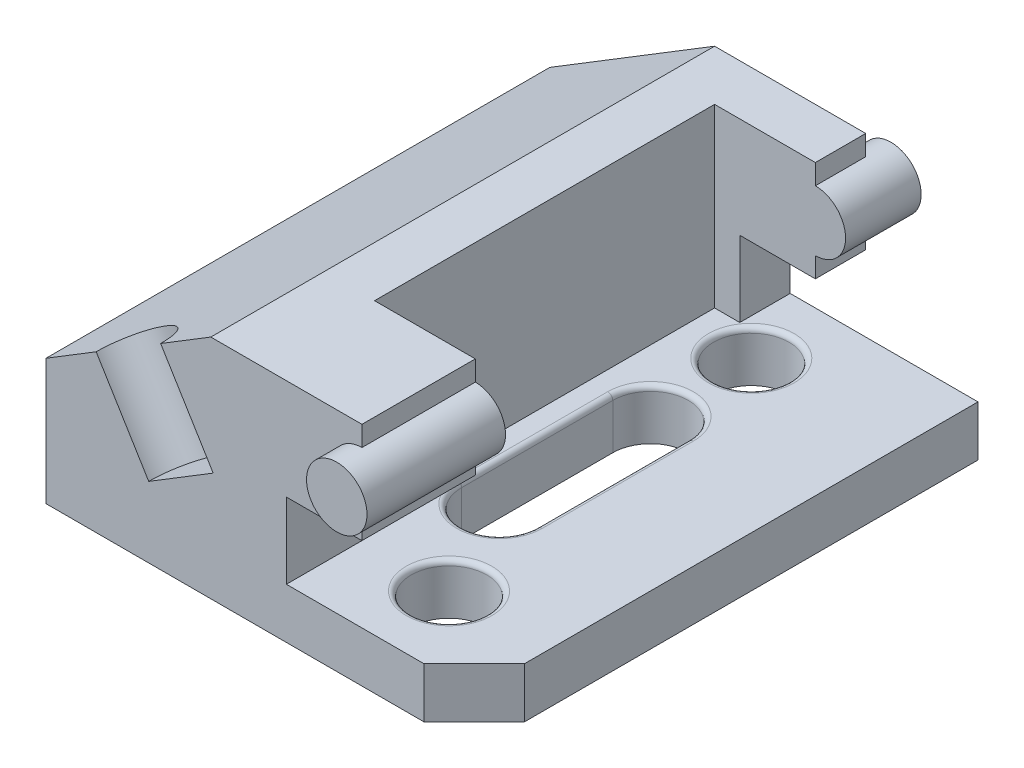
ISO-10303-21;
HEADER;
FILE_DESCRIPTION(('STEP AP214'),'2;1');
FILE_NAME('part.step','',(''),(''),'','','');
FILE_SCHEMA(('AUTOMOTIVE_DESIGN { 1 0 10303 214 1 1 1 1 }'));
ENDSEC;
DATA;
#1=APPLICATION_CONTEXT('core data for automotive mechanical design processes');
#2=APPLICATION_PROTOCOL_DEFINITION('international standard','automotive_design',2000,#1);
#3=PRODUCT_CONTEXT('',#1,'mechanical');
#4=PRODUCT('Part','Part','',(#3));
#5=PRODUCT_RELATED_PRODUCT_CATEGORY('part','',(#4));
#6=PRODUCT_DEFINITION_FORMATION('','',#4);
#7=PRODUCT_DEFINITION_CONTEXT('part definition',#1,'design');
#8=PRODUCT_DEFINITION('design','',#6,#7);
#9=PRODUCT_DEFINITION_SHAPE('','',#8);
#10=(LENGTH_UNIT() NAMED_UNIT(*) SI_UNIT(.MILLI.,.METRE.));
#11=(NAMED_UNIT(*) PLANE_ANGLE_UNIT() SI_UNIT($,.RADIAN.));
#12=(NAMED_UNIT(*) SI_UNIT($,.STERADIAN.) SOLID_ANGLE_UNIT());
#13=UNCERTAINTY_MEASURE_WITH_UNIT(LENGTH_MEASURE(1.E-05),#10,'distance_accuracy_value','');
#14=(GEOMETRIC_REPRESENTATION_CONTEXT(3) GLOBAL_UNCERTAINTY_ASSIGNED_CONTEXT((#13)) GLOBAL_UNIT_ASSIGNED_CONTEXT((#10,
#11,#12)) REPRESENTATION_CONTEXT('',''));
#15=CARTESIAN_POINT('',(0.,0.,0.));
#16=DIRECTION('',(0.,0.,1.));
#17=DIRECTION('',(1.,0.,0.));
#18=AXIS2_PLACEMENT_3D('',#15,#16,#17);
#19=CARTESIAN_POINT('',(62.7150812468734,45.,-100.));
#20=DIRECTION('',(1.,0.,0.));
#21=DIRECTION('',(0.,1.,0.));
#22=AXIS2_PLACEMENT_3D('',#19,#20,#21);
#23=PLANE('',#22);
#24=DIRECTION('',(0.,-1.,0.));
#25=VECTOR('',#24,1.);
#26=CARTESIAN_POINT('',(62.7150812468734,45.,-22.5));
#27=LINE('',#26,#25);
#28=CARTESIAN_POINT('',(62.7150812468734,29.,-22.5));
#29=VERTEX_POINT('',#28);
#30=CARTESIAN_POINT('',(62.7150812468734,25.,-22.5));
#31=VERTEX_POINT('',#30);
#32=EDGE_CURVE('E267',#29,#31,#27,.T.);
#33=ORIENTED_EDGE('',*,*,#32,.F.);
#34=DIRECTION('',(0.,0.,-1.));
#35=VECTOR('',#34,1.);
#36=CARTESIAN_POINT('',(62.7150812468734,29.,4.99999999999999));
#37=LINE('',#36,#35);
#38=CARTESIAN_POINT('',(62.7150812468734,29.,0.));
#39=VERTEX_POINT('',#38);
#40=EDGE_CURVE('E283',#29,#39,#37,.F.);
#41=ORIENTED_EDGE('',*,*,#40,.T.);
#42=DIRECTION('',(0.,1.,0.));
#43=VECTOR('',#42,1.);
#44=CARTESIAN_POINT('',(62.7150812468734,45.,0.));
#45=LINE('',#44,#43);
#46=CARTESIAN_POINT('',(62.7150812468734,25.,0.));
#47=VERTEX_POINT('',#46);
#48=EDGE_CURVE('E356',#47,#39,#45,.T.);
#49=ORIENTED_EDGE('',*,*,#48,.F.);
#50=DIRECTION('',(0.,0.,1.));
#51=VECTOR('',#50,1.);
#52=CARTESIAN_POINT('',(62.7150812468734,25.,-100.));
#53=LINE('',#52,#51);
#54=EDGE_CURVE('E377',#31,#47,#53,.T.);
#55=ORIENTED_EDGE('',*,*,#54,.F.);
#56=EDGE_LOOP('',(#33,#41,#49,#55));
#57=FACE_BOUND('',#56,.T.);
#58=ADVANCED_FACE('F37',(#57),#23,.T.);
#59=DIRECTION('',(0.,-1.,0.));
#60=VECTOR('',#59,1.);
#61=CARTESIAN_POINT('',(62.7150812468734,45.,-22.5));
#62=LINE('',#61,#60);
#63=CARTESIAN_POINT('',(62.7150812468734,45.,-22.5));
#64=VERTEX_POINT('',#63);
#65=CARTESIAN_POINT('',(62.7150812468734,41.,-22.5));
#66=VERTEX_POINT('',#65);
#67=EDGE_CURVE('E265',#64,#66,#62,.T.);
#68=ORIENTED_EDGE('',*,*,#67,.F.);
#69=DIRECTION('',(0.,0.,1.));
#70=VECTOR('',#69,1.);
#71=CARTESIAN_POINT('',(62.7150812468734,45.,-100.));
#72=LINE('',#71,#70);
#73=CARTESIAN_POINT('',(62.7150812468734,45.,0.));
#74=VERTEX_POINT('',#73);
#75=EDGE_CURVE('E373',#64,#74,#72,.T.);
#76=ORIENTED_EDGE('',*,*,#75,.T.);
#77=CARTESIAN_POINT('',(62.7150812468734,41.,0.));
#78=VERTEX_POINT('',#77);
#79=EDGE_CURVE('E355',#78,#74,#45,.T.);
#80=ORIENTED_EDGE('',*,*,#79,.F.);
#81=DIRECTION('',(0.,0.,-1.));
#82=VECTOR('',#81,1.);
#83=CARTESIAN_POINT('',(62.7150812468734,41.,4.99999999999999));
#84=LINE('',#83,#82);
#85=EDGE_CURVE('E280',#78,#66,#84,.T.);
#86=ORIENTED_EDGE('',*,*,#85,.T.);
#87=EDGE_LOOP('',(#68,#76,#80,#86));
#88=FACE_BOUND('',#87,.T.);
#89=ADVANCED_FACE('F552',(#88),#23,.T.);
#90=CARTESIAN_POINT('',(47.7150812468734,25.,-100.));
#91=DIRECTION('',(0.,-1.,0.));
#92=DIRECTION('',(0.,0.,-1.));
#93=AXIS2_PLACEMENT_3D('',#90,#91,#92);
#94=PLANE('',#93);
#95=DIRECTION('',(-1.,0.,0.));
#96=VECTOR('',#95,1.);
#97=CARTESIAN_POINT('',(47.7150812468734,25.,-22.5));
#98=LINE('',#97,#96);
#99=CARTESIAN_POINT('',(47.7150812468734,25.,-22.5));
#100=VERTEX_POINT('',#99);
#101=EDGE_CURVE('E269',#31,#100,#98,.T.);
#102=ORIENTED_EDGE('',*,*,#101,.F.);
#103=ORIENTED_EDGE('',*,*,#54,.T.);
#104=DIRECTION('',(1.,0.,0.));
#105=VECTOR('',#104,1.);
#106=CARTESIAN_POINT('',(47.7150812468734,25.,0.));
#107=LINE('',#106,#105);
#108=CARTESIAN_POINT('',(47.7150812468734,25.,0.));
#109=VERTEX_POINT('',#108);
#110=EDGE_CURVE('E352',#109,#47,#107,.T.);
#111=ORIENTED_EDGE('',*,*,#110,.F.);
#112=DIRECTION('',(0.,0.,1.));
#113=VECTOR('',#112,1.);
#114=CARTESIAN_POINT('',(47.7150812468734,25.,-100.));
#115=LINE('',#114,#113);
#116=EDGE_CURVE('E381',#100,#109,#115,.T.);
#117=ORIENTED_EDGE('',*,*,#116,.F.);
#118=EDGE_LOOP('',(#102,#103,#111,#117));
#119=FACE_BOUND('',#118,.T.);
#120=ADVANCED_FACE('F560',(#119),#94,.T.);
#121=CARTESIAN_POINT('',(47.7150812468734,9.99999999999999,-100.));
#122=DIRECTION('',(1.,0.,0.));
#123=DIRECTION('',(0.,0.,-1.));
#124=AXIS2_PLACEMENT_3D('',#121,#122,#123);
#125=PLANE('',#124);
#126=DIRECTION('',(0.,-1.,0.));
#127=VECTOR('',#126,1.);
#128=CARTESIAN_POINT('',(47.7150812468734,9.99999999999999,-22.5));
#129=LINE('',#128,#127);
#130=CARTESIAN_POINT('',(47.7150812468734,9.99999999999999,-22.5));
#131=VERTEX_POINT('',#130);
#132=EDGE_CURVE('E271',#100,#131,#129,.T.);
#133=ORIENTED_EDGE('',*,*,#132,.F.);
#134=ORIENTED_EDGE('',*,*,#116,.T.);
#135=DIRECTION('',(0.,1.,0.));
#136=VECTOR('',#135,1.);
#137=CARTESIAN_POINT('',(47.7150812468734,9.99999999999999,0.));
#138=LINE('',#137,#136);
#139=CARTESIAN_POINT('',(47.7150812468734,9.99999999999999,0.));
#140=VERTEX_POINT('',#139);
#141=EDGE_CURVE('E349',#140,#109,#138,.T.);
#142=ORIENTED_EDGE('',*,*,#141,.F.);
#143=DIRECTION('',(0.,0.,1.));
#144=VECTOR('',#143,1.);
#145=CARTESIAN_POINT('',(47.7150812468734,9.99999999999999,-100.));
#146=LINE('',#145,#144);
#147=EDGE_CURVE('E385',#131,#140,#146,.T.);
#148=ORIENTED_EDGE('',*,*,#147,.F.);
#149=EDGE_LOOP('',(#133,#134,#142,#148));
#150=FACE_BOUND('',#149,.T.);
#151=ADVANCED_FACE('F499',(#150),#125,.T.);
#152=CARTESIAN_POINT('',(62.7150812468734,35.,4.99999999999999));
#153=DIRECTION('',(0.,0.,-1.));
#154=DIRECTION('',(-1.,0.,0.));
#155=AXIS2_PLACEMENT_3D('',#152,#153,#154);
#156=CYLINDRICAL_SURFACE('',#155,6.);
#157=CARTESIAN_POINT('',(62.7150812468734,35.,4.99999999999999));
#158=DIRECTION('',(0.,0.,1.));
#159=DIRECTION('',(1.,0.,0.));
#160=AXIS2_PLACEMENT_3D('',#157,#158,#159);
#161=CIRCLE('',#160,6.);
#162=CARTESIAN_POINT('',(68.7150812468734,35.,4.99999999999999));
#163=VERTEX_POINT('',#162);
#164=EDGE_CURVE('E276',#163,#163,#161,.T.);
#165=ORIENTED_EDGE('',*,*,#164,.F.);
#166=EDGE_LOOP('',(#165));
#167=FACE_BOUND('',#166,.T.);
#168=ORIENTED_EDGE('',*,*,#40,.F.);
#169=CARTESIAN_POINT('',(62.7150812468734,35.,-22.5));
#170=DIRECTION('',(0.,0.,1.));
#171=DIRECTION('',(1.,0.,0.));
#172=AXIS2_PLACEMENT_3D('',#169,#170,#171);
#173=CIRCLE('',#172,6.);
#174=EDGE_CURVE('E423',#29,#66,#173,.T.);
#175=ORIENTED_EDGE('',*,*,#174,.T.);
#176=ORIENTED_EDGE('',*,*,#85,.F.);
#177=CARTESIAN_POINT('',(62.7150812468734,35.,0.));
#178=DIRECTION('',(0.,0.,-1.));
#179=DIRECTION('',(-1.,0.,0.));
#180=AXIS2_PLACEMENT_3D('',#177,#178,#179);
#181=CIRCLE('',#180,6.);
#182=EDGE_CURVE('E417',#78,#39,#181,.F.);
#183=ORIENTED_EDGE('',*,*,#182,.T.);
#184=EDGE_LOOP('',(#168,#175,#176,#183));
#185=FACE_BOUND('',#184,.T.);
#186=ADVANCED_FACE('F556',(#167,#185),#156,.T.);
#187=DIRECTION('',(0.,1.,0.));
#188=VECTOR('',#187,1.);
#189=CARTESIAN_POINT('',(62.7150812468734,45.,-90.));
#190=LINE('',#189,#188);
#191=CARTESIAN_POINT('',(62.7150812468734,25.,-90.));
#192=VERTEX_POINT('',#191);
#193=CARTESIAN_POINT('',(62.7150812468734,29.,-90.));
#194=VERTEX_POINT('',#193);
#195=EDGE_CURVE('E259',#192,#194,#190,.T.);
#196=ORIENTED_EDGE('',*,*,#195,.F.);
#197=CARTESIAN_POINT('',(62.7150812468734,25.,-100.));
#198=VERTEX_POINT('',#197);
#199=EDGE_CURVE('E374',#198,#192,#53,.T.);
#200=ORIENTED_EDGE('',*,*,#199,.F.);
#201=DIRECTION('',(0.,1.,0.));
#202=VECTOR('',#201,1.);
#203=CARTESIAN_POINT('',(62.7150812468734,45.,-100.));
#204=LINE('',#203,#202);
#205=CARTESIAN_POINT('',(62.7150812468734,29.,-100.));
#206=VERTEX_POINT('',#205);
#207=EDGE_CURVE('E330',#198,#206,#204,.T.);
#208=ORIENTED_EDGE('',*,*,#207,.T.);
#209=EDGE_CURVE('E284',#206,#194,#37,.F.);
#210=ORIENTED_EDGE('',*,*,#209,.T.);
#211=EDGE_LOOP('',(#196,#200,#208,#210));
#212=FACE_BOUND('',#211,.T.);
#213=ADVANCED_FACE('F542',(#212),#23,.T.);
#214=DIRECTION('',(0.,1.,0.));
#215=VECTOR('',#214,1.);
#216=CARTESIAN_POINT('',(62.7150812468734,45.,-90.));
#217=LINE('',#216,#215);
#218=CARTESIAN_POINT('',(62.7150812468734,41.,-90.));
#219=VERTEX_POINT('',#218);
#220=CARTESIAN_POINT('',(62.7150812468734,45.,-90.));
#221=VERTEX_POINT('',#220);
#222=EDGE_CURVE('E231',#219,#221,#217,.T.);
#223=ORIENTED_EDGE('',*,*,#222,.F.);
#224=CARTESIAN_POINT('',(62.7150812468734,41.,-100.));
#225=VERTEX_POINT('',#224);
#226=EDGE_CURVE('E279',#219,#225,#84,.T.);
#227=ORIENTED_EDGE('',*,*,#226,.T.);
#228=CARTESIAN_POINT('',(62.7150812468734,45.,-100.));
#229=VERTEX_POINT('',#228);
#230=EDGE_CURVE('E329',#225,#229,#204,.T.);
#231=ORIENTED_EDGE('',*,*,#230,.T.);
#232=EDGE_CURVE('E371',#229,#221,#72,.T.);
#233=ORIENTED_EDGE('',*,*,#232,.T.);
#234=EDGE_LOOP('',(#223,#227,#231,#233));
#235=FACE_BOUND('',#234,.T.);
#236=ADVANCED_FACE('F487',(#235),#23,.T.);
#237=CARTESIAN_POINT('',(85.,10.,-100.));
#238=DIRECTION('',(0.,1.,0.));
#239=DIRECTION('',(-1.,0.,0.));
#240=AXIS2_PLACEMENT_3D('',#237,#238,#239);
#241=PLANE('',#240);
#242=CARTESIAN_POINT('',(55.,9.99999999999999,-85.));
#243=DIRECTION('',(0.,1.,0.));
#244=DIRECTION('',(-1.,0.,0.));
#245=AXIS2_PLACEMENT_3D('',#242,#243,#244);
#246=CIRCLE('',#245,8.50000000000002);
#247=CARTESIAN_POINT('',(46.5,9.99999999999999,-85.));
#248=VERTEX_POINT('',#247);
#249=EDGE_CURVE('E438',#248,#248,#246,.F.);
#250=ORIENTED_EDGE('',*,*,#249,.T.);
#251=EDGE_LOOP('',(#250));
#252=FACE_BOUND('',#251,.T.);
#253=DIRECTION('',(0.,0.,1.));
#254=VECTOR('',#253,1.);
#255=CARTESIAN_POINT('',(46.5,9.99999999999999,-65.));
#256=LINE('',#255,#254);
#257=CARTESIAN_POINT('',(46.5,9.99999999999999,-35.));
#258=VERTEX_POINT('',#257);
#259=CARTESIAN_POINT('',(46.5,9.99999999999999,-65.));
#260=VERTEX_POINT('',#259);
#261=EDGE_CURVE('E429',#258,#260,#256,.F.);
#262=ORIENTED_EDGE('',*,*,#261,.T.);
#263=CARTESIAN_POINT('',(55.,9.99999999999999,-65.));
#264=DIRECTION('',(0.,1.,0.));
#265=DIRECTION('',(-1.,0.,0.));
#266=AXIS2_PLACEMENT_3D('',#263,#264,#265);
#267=CIRCLE('',#266,8.50000000000001);
#268=CARTESIAN_POINT('',(63.5,10.,-65.));
#269=VERTEX_POINT('',#268);
#270=EDGE_CURVE('E435',#260,#269,#267,.F.);
#271=ORIENTED_EDGE('',*,*,#270,.T.);
#272=DIRECTION('',(0.,0.,1.));
#273=VECTOR('',#272,1.);
#274=CARTESIAN_POINT('',(63.5000000000001,10.,-100.));
#275=LINE('',#274,#273);
#276=CARTESIAN_POINT('',(63.5,10.,-35.));
#277=VERTEX_POINT('',#276);
#278=EDGE_CURVE('E433',#269,#277,#275,.T.);
#279=ORIENTED_EDGE('',*,*,#278,.T.);
#280=CARTESIAN_POINT('',(55.,9.99999999999999,-35.));
#281=DIRECTION('',(0.,1.,0.));
#282=DIRECTION('',(-1.,0.,0.));
#283=AXIS2_PLACEMENT_3D('',#280,#281,#282);
#284=CIRCLE('',#283,8.49999999999999);
#285=EDGE_CURVE('E431',#277,#258,#284,.F.);
#286=ORIENTED_EDGE('',*,*,#285,.T.);
#287=EDGE_LOOP('',(#262,#271,#279,#286));
#288=FACE_BOUND('',#287,.T.);
#289=CARTESIAN_POINT('',(65.,10.,-15.));
#290=DIRECTION('',(0.,1.,0.));
#291=DIRECTION('',(-1.,0.,0.));
#292=AXIS2_PLACEMENT_3D('',#289,#290,#291);
#293=CIRCLE('',#292,8.50000000000001);
#294=CARTESIAN_POINT('',(56.5,10.,-15.));
#295=VERTEX_POINT('',#294);
#296=EDGE_CURVE('E426',#295,#295,#293,.F.);
#297=ORIENTED_EDGE('',*,*,#296,.T.);
#298=EDGE_LOOP('',(#297));
#299=FACE_BOUND('',#298,.T.);
#300=DIRECTION('',(-1.,0.,0.));
#301=VECTOR('',#300,1.);
#302=CARTESIAN_POINT('',(42.7150812468734,9.99999999999999,-22.5));
#303=LINE('',#302,#301);
#304=CARTESIAN_POINT('',(42.7150812468734,9.99999999999999,-22.5));
#305=VERTEX_POINT('',#304);
#306=EDGE_CURVE('E257',#131,#305,#303,.T.);
#307=ORIENTED_EDGE('',*,*,#306,.F.);
#308=ORIENTED_EDGE('',*,*,#147,.T.);
#309=DIRECTION('',(-1.,0.,0.));
#310=VECTOR('',#309,1.);
#311=CARTESIAN_POINT('',(85.,10.,0.));
#312=LINE('',#311,#310);
#313=CARTESIAN_POINT('',(74.9999999999999,10.,0.));
#314=VERTEX_POINT('',#313);
#315=EDGE_CURVE('E346',#314,#140,#312,.T.);
#316=ORIENTED_EDGE('',*,*,#315,.F.);
#317=DIRECTION('',(-0.707106781186551,0.,0.707106781186544));
#318=VECTOR('',#317,1.);
#319=CARTESIAN_POINT('',(74.9999999999999,10.,0.));
#320=LINE('',#319,#318);
#321=CARTESIAN_POINT('',(85.,10.,-10.));
#322=VERTEX_POINT('',#321);
#323=EDGE_CURVE('E292',#322,#314,#320,.T.);
#324=ORIENTED_EDGE('',*,*,#323,.F.);
#325=DIRECTION('',(0.,0.,1.));
#326=VECTOR('',#325,1.);
#327=CARTESIAN_POINT('',(85.,10.,-100.));
#328=LINE('',#327,#326);
#329=CARTESIAN_POINT('',(85.,10.,-100.));
#330=VERTEX_POINT('',#329);
#331=EDGE_CURVE('E386',#330,#322,#328,.T.);
#332=ORIENTED_EDGE('',*,*,#331,.F.);
#333=DIRECTION('',(-1.,0.,0.));
#334=VECTOR('',#333,1.);
#335=CARTESIAN_POINT('',(85.,10.,-100.));
#336=LINE('',#335,#334);
#337=CARTESIAN_POINT('',(47.7150812468734,9.99999999999999,-100.));
#338=VERTEX_POINT('',#337);
#339=EDGE_CURVE('E320',#330,#338,#336,.T.);
#340=ORIENTED_EDGE('',*,*,#339,.T.);
#341=CARTESIAN_POINT('',(47.7150812468734,9.99999999999999,-90.));
#342=VERTEX_POINT('',#341);
#343=EDGE_CURVE('E382',#338,#342,#146,.T.);
#344=ORIENTED_EDGE('',*,*,#343,.T.);
#345=DIRECTION('',(1.,0.,0.));
#346=VECTOR('',#345,1.);
#347=CARTESIAN_POINT('',(62.7150812468734,9.99999999999999,-90.));
#348=LINE('',#347,#346);
#349=CARTESIAN_POINT('',(42.7150812468734,9.99999999999999,-90.));
#350=VERTEX_POINT('',#349);
#351=EDGE_CURVE('E255',#350,#342,#348,.T.);
#352=ORIENTED_EDGE('',*,*,#351,.F.);
#353=DIRECTION('',(0.,0.,-1.));
#354=VECTOR('',#353,1.);
#355=CARTESIAN_POINT('',(42.7150812468734,9.99999999999999,-90.));
#356=LINE('',#355,#354);
#357=EDGE_CURVE('E244',#305,#350,#356,.T.);
#358=ORIENTED_EDGE('',*,*,#357,.F.);
#359=EDGE_LOOP('',(#307,#308,#316,#324,#332,#340,#344,#352,#358));
#360=FACE_BOUND('',#359,.T.);
#361=ADVANCED_FACE('F483',(#252,#288,#299,#360),#241,.T.);
#362=CARTESIAN_POINT('',(0.,0.,-100.));
#363=DIRECTION('',(-1.,0.,0.));
#364=DIRECTION('',(0.,0.,1.));
#365=AXIS2_PLACEMENT_3D('',#362,#363,#364);
#366=PLANE('',#365);
#367=DIRECTION('',(0.,-1.,0.));
#368=VECTOR('',#367,1.);
#369=CARTESIAN_POINT('',(0.,0.,0.));
#370=LINE('',#369,#368);
#371=CARTESIAN_POINT('',(0.,25.,0.));
#372=VERTEX_POINT('',#371);
#373=CARTESIAN_POINT('',(0.,0.,0.));
#374=VERTEX_POINT('',#373);
#375=EDGE_CURVE('E340',#372,#374,#370,.T.);
#376=ORIENTED_EDGE('',*,*,#375,.F.);
#377=DIRECTION('',(0.,0.,1.));
#378=VECTOR('',#377,1.);
#379=CARTESIAN_POINT('',(0.,25.,-100.));
#380=LINE('',#379,#378);
#381=CARTESIAN_POINT('',(0.,25.,-100.));
#382=VERTEX_POINT('',#381);
#383=EDGE_CURVE('E365',#382,#372,#380,.T.);
#384=ORIENTED_EDGE('',*,*,#383,.F.);
#385=DIRECTION('',(0.,-1.,0.));
#386=VECTOR('',#385,1.);
#387=CARTESIAN_POINT('',(0.,0.,-100.));
#388=LINE('',#387,#386);
#389=CARTESIAN_POINT('',(0.,0.,-100.));
#390=VERTEX_POINT('',#389);
#391=EDGE_CURVE('E310',#382,#390,#388,.T.);
#392=ORIENTED_EDGE('',*,*,#391,.T.);
#393=DIRECTION('',(0.,0.,1.));
#394=VECTOR('',#393,1.);
#395=CARTESIAN_POINT('',(0.,0.,-100.));
#396=LINE('',#395,#394);
#397=EDGE_CURVE('E339',#390,#374,#396,.T.);
#398=ORIENTED_EDGE('',*,*,#397,.T.);
#399=EDGE_LOOP('',(#376,#384,#392,#398));
#400=FACE_BOUND('',#399,.T.);
#401=ADVANCED_FACE('F486',(#400),#366,.T.);
#402=CARTESIAN_POINT('',(0.,25.,-100.));
#403=DIRECTION('',(-0.521591471556442,0.853195368482263,0.));
#404=DIRECTION('',(-0.853195368482263,-0.521591471556442,0.));
#405=AXIS2_PLACEMENT_3D('',#402,#403,#404);
#406=PLANE('',#405);
#407=CARTESIAN_POINT('',(16.3575406234367,35.,0.));
#408=DIRECTION('',(-0.521591471556442,0.853195368482263,0.));
#409=DIRECTION('',(-0.853195368482263,-0.521591471556442,0.));
#410=AXIS2_PLACEMENT_3D('',#407,#408,#409);
#411=CIRCLE('',#410,7.5);
#412=CARTESIAN_POINT('',(22.7565058870537,38.9119360366733,0.));
#413=VERTEX_POINT('',#412);
#414=CARTESIAN_POINT('',(9.95857535981973,31.0880639633267,0.));
#415=VERTEX_POINT('',#414);
#416=EDGE_CURVE('E289',#413,#415,#411,.T.);
#417=ORIENTED_EDGE('',*,*,#416,.F.);
#418=DIRECTION('',(-0.853195368482263,-0.521591471556442,0.));
#419=VECTOR('',#418,1.);
#420=CARTESIAN_POINT('',(0.,25.,0.));
#421=LINE('',#420,#419);
#422=CARTESIAN_POINT('',(32.7150812468734,45.,0.));
#423=VERTEX_POINT('',#422);
#424=EDGE_CURVE('E314',#423,#413,#421,.T.);
#425=ORIENTED_EDGE('',*,*,#424,.F.);
#426=DIRECTION('',(0.,0.,1.));
#427=VECTOR('',#426,1.);
#428=CARTESIAN_POINT('',(32.7150812468734,45.,-100.));
#429=LINE('',#428,#427);
#430=CARTESIAN_POINT('',(32.7150812468734,45.,-100.));
#431=VERTEX_POINT('',#430);
#432=EDGE_CURVE('E369',#431,#423,#429,.T.);
#433=ORIENTED_EDGE('',*,*,#432,.F.);
#434=DIRECTION('',(-0.853195368482263,-0.521591471556442,0.));
#435=VECTOR('',#434,1.);
#436=CARTESIAN_POINT('',(0.,25.,-100.));
#437=LINE('',#436,#435);
#438=EDGE_CURVE('E336',#431,#382,#437,.T.);
#439=ORIENTED_EDGE('',*,*,#438,.T.);
#440=ORIENTED_EDGE('',*,*,#383,.T.);
#441=EDGE_CURVE('E362',#415,#372,#421,.T.);
#442=ORIENTED_EDGE('',*,*,#441,.F.);
#443=EDGE_LOOP('',(#417,#425,#433,#439,#440,#442));
#444=FACE_BOUND('',#443,.T.);
#445=ADVANCED_FACE('F528',(#444),#406,.T.);
#446=CARTESIAN_POINT('',(32.7150812468734,45.,-100.));
#447=DIRECTION('',(0.,1.,0.));
#448=DIRECTION('',(-1.,0.,0.));
#449=AXIS2_PLACEMENT_3D('',#446,#447,#448);
#450=PLANE('',#449);
#451=DIRECTION('',(1.,0.,0.));
#452=VECTOR('',#451,1.);
#453=CARTESIAN_POINT('',(42.7150812468734,45.,-22.5));
#454=LINE('',#453,#452);
#455=CARTESIAN_POINT('',(42.7150812468734,45.,-22.5));
#456=VERTEX_POINT('',#455);
#457=EDGE_CURVE('E246',#456,#64,#454,.T.);
#458=ORIENTED_EDGE('',*,*,#457,.F.);
#459=DIRECTION('',(0.,0.,1.));
#460=VECTOR('',#459,1.);
#461=CARTESIAN_POINT('',(42.7150812468734,45.,-90.));
#462=LINE('',#461,#460);
#463=CARTESIAN_POINT('',(42.7150812468734,45.,-90.));
#464=VERTEX_POINT('',#463);
#465=EDGE_CURVE('E236',#464,#456,#462,.T.);
#466=ORIENTED_EDGE('',*,*,#465,.F.);
#467=DIRECTION('',(-1.,0.,0.));
#468=VECTOR('',#467,1.);
#469=CARTESIAN_POINT('',(62.7150812468734,45.,-90.));
#470=LINE('',#469,#468);
#471=EDGE_CURVE('E225',#221,#464,#470,.T.);
#472=ORIENTED_EDGE('',*,*,#471,.F.);
#473=ORIENTED_EDGE('',*,*,#232,.F.);
#474=DIRECTION('',(-1.,0.,0.));
#475=VECTOR('',#474,1.);
#476=CARTESIAN_POINT('',(32.7150812468734,45.,-100.));
#477=LINE('',#476,#475);
#478=EDGE_CURVE('E333',#229,#431,#477,.T.);
#479=ORIENTED_EDGE('',*,*,#478,.T.);
#480=ORIENTED_EDGE('',*,*,#432,.T.);
#481=DIRECTION('',(-1.,0.,0.));
#482=VECTOR('',#481,1.);
#483=CARTESIAN_POINT('',(32.7150812468734,45.,0.));
#484=LINE('',#483,#482);
#485=EDGE_CURVE('E359',#74,#423,#484,.T.);
#486=ORIENTED_EDGE('',*,*,#485,.F.);
#487=ORIENTED_EDGE('',*,*,#75,.F.);
#488=EDGE_LOOP('',(#458,#466,#472,#473,#479,#480,#486,#487));
#489=FACE_BOUND('',#488,.T.);
#490=ADVANCED_FACE('F248',(#489),#450,.T.);
#491=DIRECTION('',(1.,0.,0.));
#492=VECTOR('',#491,1.);
#493=CARTESIAN_POINT('',(47.7150812468734,25.,-90.));
#494=LINE('',#493,#492);
#495=CARTESIAN_POINT('',(47.7150812468734,25.,-90.));
#496=VERTEX_POINT('',#495);
#497=EDGE_CURVE('E261',#496,#192,#494,.T.);
#498=ORIENTED_EDGE('',*,*,#497,.F.);
#499=CARTESIAN_POINT('',(47.7150812468734,25.,-100.));
#500=VERTEX_POINT('',#499);
#501=EDGE_CURVE('E378',#500,#496,#115,.T.);
#502=ORIENTED_EDGE('',*,*,#501,.F.);
#503=DIRECTION('',(1.,0.,0.));
#504=VECTOR('',#503,1.);
#505=CARTESIAN_POINT('',(47.7150812468734,25.,-100.));
#506=LINE('',#505,#504);
#507=EDGE_CURVE('E326',#500,#198,#506,.T.);
#508=ORIENTED_EDGE('',*,*,#507,.T.);
#509=ORIENTED_EDGE('',*,*,#199,.T.);
#510=EDGE_LOOP('',(#498,#502,#508,#509));
#511=FACE_BOUND('',#510,.T.);
#512=ADVANCED_FACE('F546',(#511),#94,.T.);
#513=DIRECTION('',(0.,1.,0.));
#514=VECTOR('',#513,1.);
#515=CARTESIAN_POINT('',(47.7150812468734,9.99999999999999,-90.));
#516=LINE('',#515,#514);
#517=EDGE_CURVE('E263',#342,#496,#516,.T.);
#518=ORIENTED_EDGE('',*,*,#517,.F.);
#519=ORIENTED_EDGE('',*,*,#343,.F.);
#520=DIRECTION('',(0.,1.,0.));
#521=VECTOR('',#520,1.);
#522=CARTESIAN_POINT('',(47.7150812468734,9.99999999999999,-100.));
#523=LINE('',#522,#521);
#524=EDGE_CURVE('E323',#338,#500,#523,.T.);
#525=ORIENTED_EDGE('',*,*,#524,.T.);
#526=ORIENTED_EDGE('',*,*,#501,.T.);
#527=EDGE_LOOP('',(#518,#519,#525,#526));
#528=FACE_BOUND('',#527,.T.);
#529=ADVANCED_FACE('F549',(#528),#125,.T.);
#530=CARTESIAN_POINT('',(85.,10.,-100.));
#531=DIRECTION('',(1.,0.,0.));
#532=DIRECTION('',(0.,0.,-1.));
#533=AXIS2_PLACEMENT_3D('',#530,#531,#532);
#534=PLANE('',#533);
#535=DIRECTION('',(0.,1.,0.));
#536=VECTOR('',#535,1.);
#537=CARTESIAN_POINT('',(85.,-90.,-10.));
#538=LINE('',#537,#536);
#539=CARTESIAN_POINT('',(85.,0.,-10.));
#540=VERTEX_POINT('',#539);
#541=EDGE_CURVE('E295',#540,#322,#538,.T.);
#542=ORIENTED_EDGE('',*,*,#541,.F.);
#543=DIRECTION('',(0.,0.,1.));
#544=VECTOR('',#543,1.);
#545=CARTESIAN_POINT('',(85.,0.,-100.));
#546=LINE('',#545,#544);
#547=CARTESIAN_POINT('',(85.,0.,-100.));
#548=VERTEX_POINT('',#547);
#549=EDGE_CURVE('E389',#548,#540,#546,.T.);
#550=ORIENTED_EDGE('',*,*,#549,.F.);
#551=DIRECTION('',(0.,1.,0.));
#552=VECTOR('',#551,1.);
#553=CARTESIAN_POINT('',(85.,10.,-100.));
#554=LINE('',#553,#552);
#555=EDGE_CURVE('E317',#548,#330,#554,.T.);
#556=ORIENTED_EDGE('',*,*,#555,.T.);
#557=ORIENTED_EDGE('',*,*,#331,.T.);
#558=EDGE_LOOP('',(#542,#550,#556,#557));
#559=FACE_BOUND('',#558,.T.);
#560=ADVANCED_FACE('F509',(#559),#534,.T.);
#561=CARTESIAN_POINT('',(0.,0.,-100.));
#562=DIRECTION('',(0.,-1.,0.));
#563=DIRECTION('',(0.,0.,-1.));
#564=AXIS2_PLACEMENT_3D('',#561,#562,#563);
#565=PLANE('',#564);
#566=DIRECTION('',(0.707106781186551,0.,-0.707106781186544));
#567=VECTOR('',#566,1.);
#568=CARTESIAN_POINT('',(87.4999999999996,0.,-12.4999999999995));
#569=LINE('',#568,#567);
#570=CARTESIAN_POINT('',(74.9999999999999,0.,0.));
#571=VERTEX_POINT('',#570);
#572=EDGE_CURVE('E297',#571,#540,#569,.T.);
#573=ORIENTED_EDGE('',*,*,#572,.F.);
#574=DIRECTION('',(1.,0.,0.));
#575=VECTOR('',#574,1.);
#576=CARTESIAN_POINT('',(0.,0.,0.));
#577=LINE('',#576,#575);
#578=EDGE_CURVE('E343',#374,#571,#577,.T.);
#579=ORIENTED_EDGE('',*,*,#578,.F.);
#580=ORIENTED_EDGE('',*,*,#397,.F.);
#581=DIRECTION('',(1.,0.,0.));
#582=VECTOR('',#581,1.);
#583=CARTESIAN_POINT('',(0.,0.,-100.));
#584=LINE('',#583,#582);
#585=EDGE_CURVE('E313',#390,#548,#584,.T.);
#586=ORIENTED_EDGE('',*,*,#585,.T.);
#587=ORIENTED_EDGE('',*,*,#549,.T.);
#588=EDGE_LOOP('',(#573,#579,#580,#586,#587));
#589=FACE_BOUND('',#588,.T.);
#590=CARTESIAN_POINT('',(55.,0.,-85.));
#591=DIRECTION('',(0.,-1.,0.));
#592=DIRECTION('',(0.,0.,-1.));
#593=AXIS2_PLACEMENT_3D('',#590,#591,#592);
#594=CIRCLE('',#593,7.50000000000002);
#595=CARTESIAN_POINT('',(55.,0.,-92.5));
#596=VERTEX_POINT('',#595);
#597=EDGE_CURVE('E299',#596,#596,#594,.T.);
#598=ORIENTED_EDGE('',*,*,#597,.F.);
#599=EDGE_LOOP('',(#598));
#600=FACE_BOUND('',#599,.T.);
#601=DIRECTION('',(0.,0.,-1.));
#602=VECTOR('',#601,1.);
#603=CARTESIAN_POINT('',(47.5,0.,-100.));
#604=LINE('',#603,#602);
#605=CARTESIAN_POINT('',(47.5,0.,-35.));
#606=VERTEX_POINT('',#605);
#607=CARTESIAN_POINT('',(47.5,0.,-65.));
#608=VERTEX_POINT('',#607);
#609=EDGE_CURVE('E402',#606,#608,#604,.T.);
#610=ORIENTED_EDGE('',*,*,#609,.F.);
#611=CARTESIAN_POINT('',(55.,0.,-35.));
#612=DIRECTION('',(0.,-1.,0.));
#613=DIRECTION('',(0.,0.,-1.));
#614=AXIS2_PLACEMENT_3D('',#611,#612,#613);
#615=CIRCLE('',#614,7.49999999999999);
#616=CARTESIAN_POINT('',(62.5,0.,-35.));
#617=VERTEX_POINT('',#616);
#618=EDGE_CURVE('E368',#617,#606,#615,.T.);
#619=ORIENTED_EDGE('',*,*,#618,.F.);
#620=DIRECTION('',(0.,0.,-1.));
#621=VECTOR('',#620,1.);
#622=CARTESIAN_POINT('',(62.5000000000001,0.,-99.9999999999999));
#623=LINE('',#622,#621);
#624=CARTESIAN_POINT('',(62.5,0.,-65.));
#625=VERTEX_POINT('',#624);
#626=EDGE_CURVE('E396',#617,#625,#623,.T.);
#627=ORIENTED_EDGE('',*,*,#626,.T.);
#628=CARTESIAN_POINT('',(55.,0.,-65.));
#629=DIRECTION('',(0.,-1.,0.));
#630=DIRECTION('',(0.,0.,-1.));
#631=AXIS2_PLACEMENT_3D('',#628,#629,#630);
#632=CIRCLE('',#631,7.50000000000001);
#633=EDGE_CURVE('E399',#625,#608,#632,.F.);
#634=ORIENTED_EDGE('',*,*,#633,.T.);
#635=EDGE_LOOP('',(#610,#619,#627,#634));
#636=FACE_BOUND('',#635,.T.);
#637=CARTESIAN_POINT('',(65.,0.,-15.));
#638=DIRECTION('',(0.,-1.,0.));
#639=DIRECTION('',(0.,0.,-1.));
#640=AXIS2_PLACEMENT_3D('',#637,#638,#639);
#641=CIRCLE('',#640,7.50000000000001);
#642=CARTESIAN_POINT('',(65.,0.,-22.5));
#643=VERTEX_POINT('',#642);
#644=EDGE_CURVE('E302',#643,#643,#641,.T.);
#645=ORIENTED_EDGE('',*,*,#644,.F.);
#646=EDGE_LOOP('',(#645));
#647=FACE_BOUND('',#646,.T.);
#648=ADVANCED_FACE('F519',(#589,#600,#636,#647),#565,.T.);
#649=CARTESIAN_POINT('',(0.,0.,-100.));
#650=DIRECTION('',(0.,0.,-1.));
#651=DIRECTION('',(-1.,0.,0.));
#652=AXIS2_PLACEMENT_3D('',#649,#650,#651);
#653=PLANE('',#652);
#654=ORIENTED_EDGE('',*,*,#230,.F.);
#655=CARTESIAN_POINT('',(62.7150812468734,35.,-100.));
#656=DIRECTION('',(0.,0.,-1.));
#657=DIRECTION('',(-1.,0.,0.));
#658=AXIS2_PLACEMENT_3D('',#655,#656,#657);
#659=CIRCLE('',#658,6.);
#660=EDGE_CURVE('E287',#225,#206,#659,.F.);
#661=ORIENTED_EDGE('',*,*,#660,.T.);
#662=ORIENTED_EDGE('',*,*,#207,.F.);
#663=ORIENTED_EDGE('',*,*,#507,.F.);
#664=ORIENTED_EDGE('',*,*,#524,.F.);
#665=ORIENTED_EDGE('',*,*,#339,.F.);
#666=ORIENTED_EDGE('',*,*,#555,.F.);
#667=ORIENTED_EDGE('',*,*,#585,.F.);
#668=ORIENTED_EDGE('',*,*,#391,.F.);
#669=ORIENTED_EDGE('',*,*,#438,.F.);
#670=ORIENTED_EDGE('',*,*,#478,.F.);
#671=EDGE_LOOP('',(#654,#661,#662,#663,#664,#665,#666,#667,#668,#669,#670));
#672=FACE_BOUND('',#671,.T.);
#673=ADVANCED_FACE('F514',(#672),#653,.T.);
#674=CARTESIAN_POINT('',(0.,0.,0.));
#675=DIRECTION('',(0.,0.,-1.));
#676=DIRECTION('',(-1.,0.,0.));
#677=AXIS2_PLACEMENT_3D('',#674,#675,#676);
#678=PLANE('',#677);
#679=ORIENTED_EDGE('',*,*,#182,.F.);
#680=ORIENTED_EDGE('',*,*,#79,.T.);
#681=ORIENTED_EDGE('',*,*,#485,.T.);
#682=ORIENTED_EDGE('',*,*,#424,.T.);
#683=DIRECTION('',(-0.521591471556442,0.853195368482263,0.));
#684=VECTOR('',#683,1.);
#685=CARTESIAN_POINT('',(33.1883353181825,21.8480286670281,0.));
#686=LINE('',#685,#684);
#687=CARTESIAN_POINT('',(33.1883353181825,21.8480286670281,0.));
#688=VERTEX_POINT('',#687);
#689=EDGE_CURVE('E411',#413,#688,#686,.F.);
#690=ORIENTED_EDGE('',*,*,#689,.T.);
#691=DIRECTION('',(0.853195368482263,0.521591471556442,0.));
#692=VECTOR('',#691,1.);
#693=CARTESIAN_POINT('',(-0.693656263166273,1.13465105034436,0.));
#694=LINE('',#693,#692);
#695=CARTESIAN_POINT('',(20.3904047909486,14.0241565936814,0.));
#696=VERTEX_POINT('',#695);
#697=EDGE_CURVE('E409',#696,#688,#694,.T.);
#698=ORIENTED_EDGE('',*,*,#697,.F.);
#699=DIRECTION('',(-0.521591471556442,0.853195368482263,0.));
#700=VECTOR('',#699,1.);
#701=CARTESIAN_POINT('',(20.3904047909486,14.0241565936814,0.));
#702=LINE('',#701,#700);
#703=EDGE_CURVE('E414',#696,#415,#702,.T.);
#704=ORIENTED_EDGE('',*,*,#703,.T.);
#705=ORIENTED_EDGE('',*,*,#441,.T.);
#706=ORIENTED_EDGE('',*,*,#375,.T.);
#707=ORIENTED_EDGE('',*,*,#578,.T.);
#708=DIRECTION('',(0.,1.,0.));
#709=VECTOR('',#708,1.);
#710=CARTESIAN_POINT('',(74.9999999999999,0.,0.));
#711=LINE('',#710,#709);
#712=EDGE_CURVE('E404',#571,#314,#711,.T.);
#713=ORIENTED_EDGE('',*,*,#712,.T.);
#714=ORIENTED_EDGE('',*,*,#315,.T.);
#715=ORIENTED_EDGE('',*,*,#141,.T.);
#716=ORIENTED_EDGE('',*,*,#110,.T.);
#717=ORIENTED_EDGE('',*,*,#48,.T.);
#718=EDGE_LOOP('',(#679,#680,#681,#682,#690,#698,#704,#705,#706,#707,#713,#714,#715,#716,#717));
#719=FACE_BOUND('',#718,.T.);
#720=ADVANCED_FACE('F503',(#719),#678,.F.);
#721=CARTESIAN_POINT('',(65.,-90.,-15.));
#722=DIRECTION('',(0.,1.,0.));
#723=DIRECTION('',(-1.,0.,0.));
#724=AXIS2_PLACEMENT_3D('',#721,#722,#723);
#725=CYLINDRICAL_SURFACE('',#724,7.50000000000001);
#726=CARTESIAN_POINT('',(65.,8.99999999999999,-15.));
#727=DIRECTION('',(0.,1.,0.));
#728=DIRECTION('',(-1.,0.,0.));
#729=AXIS2_PLACEMENT_3D('',#726,#727,#728);
#730=CIRCLE('',#729,7.50000000000001);
#731=CARTESIAN_POINT('',(57.5,8.99999999999999,-15.));
#732=VERTEX_POINT('',#731);
#733=EDGE_CURVE('E11',#732,#732,#730,.T.);
#734=ORIENTED_EDGE('',*,*,#733,.T.);
#735=EDGE_LOOP('',(#734));
#736=FACE_BOUND('',#735,.T.);
#737=ORIENTED_EDGE('',*,*,#644,.T.);
#738=EDGE_LOOP('',(#737));
#739=FACE_BOUND('',#738,.T.);
#740=ADVANCED_FACE('F611',(#736,#739),#725,.F.);
#741=CARTESIAN_POINT('',(47.5,-90.,-65.));
#742=DIRECTION('',(-1.,0.,0.));
#743=DIRECTION('',(0.,0.,1.));
#744=AXIS2_PLACEMENT_3D('',#741,#742,#743);
#745=PLANE('',#744);
#746=DIRECTION('',(0.,1.,0.));
#747=VECTOR('',#746,1.);
#748=CARTESIAN_POINT('',(47.5,-90.,-65.));
#749=LINE('',#748,#747);
#750=CARTESIAN_POINT('',(47.5,8.99999999999999,-65.));
#751=VERTEX_POINT('',#750);
#752=EDGE_CURVE('E300',#608,#751,#749,.T.);
#753=ORIENTED_EDGE('',*,*,#752,.T.);
#754=DIRECTION('',(0.,0.,1.));
#755=VECTOR('',#754,1.);
#756=CARTESIAN_POINT('',(47.5,8.99999999999999,-35.));
#757=LINE('',#756,#755);
#758=CARTESIAN_POINT('',(47.5,8.99999999999999,-35.));
#759=VERTEX_POINT('',#758);
#760=EDGE_CURVE('E46',#751,#759,#757,.T.);
#761=ORIENTED_EDGE('',*,*,#760,.T.);
#762=DIRECTION('',(0.,1.,0.));
#763=VECTOR('',#762,1.);
#764=CARTESIAN_POINT('',(47.5,-90.,-35.));
#765=LINE('',#764,#763);
#766=EDGE_CURVE('E308',#606,#759,#765,.T.);
#767=ORIENTED_EDGE('',*,*,#766,.F.);
#768=ORIENTED_EDGE('',*,*,#609,.T.);
#769=EDGE_LOOP('',(#753,#761,#767,#768));
#770=FACE_BOUND('',#769,.T.);
#771=ADVANCED_FACE('F604',(#770),#745,.F.);
#772=CARTESIAN_POINT('',(55.,-90.,-65.));
#773=DIRECTION('',(0.,1.,0.));
#774=DIRECTION('',(-1.,0.,0.));
#775=AXIS2_PLACEMENT_3D('',#772,#773,#774);
#776=CYLINDRICAL_SURFACE('',#775,7.50000000000001);
#777=DIRECTION('',(0.,1.,0.));
#778=VECTOR('',#777,1.);
#779=CARTESIAN_POINT('',(62.5,-90.,-65.));
#780=LINE('',#779,#778);
#781=CARTESIAN_POINT('',(62.5,8.99999999999999,-65.));
#782=VERTEX_POINT('',#781);
#783=EDGE_CURVE('E303',#625,#782,#780,.T.);
#784=ORIENTED_EDGE('',*,*,#783,.T.);
#785=CARTESIAN_POINT('',(55.,8.99999999999999,-65.));
#786=DIRECTION('',(0.,1.,0.));
#787=DIRECTION('',(-1.,0.,0.));
#788=AXIS2_PLACEMENT_3D('',#785,#786,#787);
#789=CIRCLE('',#788,7.50000000000001);
#790=EDGE_CURVE('E441',#782,#751,#789,.T.);
#791=ORIENTED_EDGE('',*,*,#790,.T.);
#792=ORIENTED_EDGE('',*,*,#752,.F.);
#793=ORIENTED_EDGE('',*,*,#633,.F.);
#794=EDGE_LOOP('',(#784,#791,#792,#793));
#795=FACE_BOUND('',#794,.T.);
#796=ADVANCED_FACE('F477',(#795),#776,.F.);
#797=CARTESIAN_POINT('',(62.5,-90.,-65.));
#798=DIRECTION('',(-1.,0.,0.));
#799=DIRECTION('',(0.,0.,1.));
#800=AXIS2_PLACEMENT_3D('',#797,#798,#799);
#801=PLANE('',#800);
#802=DIRECTION('',(0.,1.,0.));
#803=VECTOR('',#802,1.);
#804=CARTESIAN_POINT('',(62.5,-90.,-35.));
#805=LINE('',#804,#803);
#806=CARTESIAN_POINT('',(62.5,8.99999999999999,-35.));
#807=VERTEX_POINT('',#806);
#808=EDGE_CURVE('E306',#617,#807,#805,.T.);
#809=ORIENTED_EDGE('',*,*,#808,.T.);
#810=DIRECTION('',(0.,0.,1.));
#811=VECTOR('',#810,1.);
#812=CARTESIAN_POINT('',(62.5,8.99999999999999,-65.));
#813=LINE('',#812,#811);
#814=EDGE_CURVE('E444',#807,#782,#813,.F.);
#815=ORIENTED_EDGE('',*,*,#814,.T.);
#816=ORIENTED_EDGE('',*,*,#783,.F.);
#817=ORIENTED_EDGE('',*,*,#626,.F.);
#818=EDGE_LOOP('',(#809,#815,#816,#817));
#819=FACE_BOUND('',#818,.T.);
#820=ADVANCED_FACE('F473',(#819),#801,.T.);
#821=CARTESIAN_POINT('',(55.,-90.,-35.));
#822=DIRECTION('',(0.,1.,0.));
#823=DIRECTION('',(-1.,0.,0.));
#824=AXIS2_PLACEMENT_3D('',#821,#822,#823);
#825=CYLINDRICAL_SURFACE('',#824,7.49999999999999);
#826=ORIENTED_EDGE('',*,*,#766,.T.);
#827=CARTESIAN_POINT('',(55.,8.99999999999999,-35.));
#828=DIRECTION('',(0.,1.,0.));
#829=DIRECTION('',(-1.,0.,0.));
#830=AXIS2_PLACEMENT_3D('',#827,#828,#829);
#831=CIRCLE('',#830,7.49999999999999);
#832=EDGE_CURVE('E60',#759,#807,#831,.T.);
#833=ORIENTED_EDGE('',*,*,#832,.T.);
#834=ORIENTED_EDGE('',*,*,#808,.F.);
#835=ORIENTED_EDGE('',*,*,#618,.T.);
#836=EDGE_LOOP('',(#826,#833,#834,#835));
#837=FACE_BOUND('',#836,.T.);
#838=ADVANCED_FACE('F600',(#837),#825,.F.);
#839=CARTESIAN_POINT('',(55.,-90.,-85.));
#840=DIRECTION('',(0.,1.,0.));
#841=DIRECTION('',(-1.,0.,0.));
#842=AXIS2_PLACEMENT_3D('',#839,#840,#841);
#843=CYLINDRICAL_SURFACE('',#842,7.50000000000002);
#844=CARTESIAN_POINT('',(55.,8.99999999999999,-85.));
#845=DIRECTION('',(0.,1.,0.));
#846=DIRECTION('',(-1.,0.,0.));
#847=AXIS2_PLACEMENT_3D('',#844,#845,#846);
#848=CIRCLE('',#847,7.50000000000002);
#849=CARTESIAN_POINT('',(47.5,8.99999999999999,-85.));
#850=VERTEX_POINT('',#849);
#851=EDGE_CURVE('E447',#850,#850,#848,.T.);
#852=ORIENTED_EDGE('',*,*,#851,.T.);
#853=EDGE_LOOP('',(#852));
#854=FACE_BOUND('',#853,.T.);
#855=ORIENTED_EDGE('',*,*,#597,.T.);
#856=EDGE_LOOP('',(#855));
#857=FACE_BOUND('',#856,.T.);
#858=ADVANCED_FACE('F597',(#854,#857),#843,.F.);
#859=CARTESIAN_POINT('',(74.9999999999999,-90.,0.));
#860=DIRECTION('',(-0.707106781186544,0.,-0.707106781186551));
#861=DIRECTION('',(-0.707106781186551,0.,0.707106781186544));
#862=AXIS2_PLACEMENT_3D('',#859,#860,#861);
#863=PLANE('',#862);
#864=ORIENTED_EDGE('',*,*,#572,.T.);
#865=ORIENTED_EDGE('',*,*,#541,.T.);
#866=ORIENTED_EDGE('',*,*,#323,.T.);
#867=ORIENTED_EDGE('',*,*,#712,.F.);
#868=EDGE_LOOP('',(#864,#865,#866,#867));
#869=FACE_BOUND('',#868,.T.);
#870=ADVANCED_FACE('F591',(#869),#863,.F.);
#871=CARTESIAN_POINT('',(26.7893700545655,17.9360926303547,0.));
#872=DIRECTION('',(-0.521591471556442,0.853195368482263,0.));
#873=DIRECTION('',(-0.853195368482263,-0.521591471556442,0.));
#874=AXIS2_PLACEMENT_3D('',#871,#872,#873);
#875=CYLINDRICAL_SURFACE('',#874,7.5);
#876=CARTESIAN_POINT('',(26.7893700545655,17.9360926303547,0.));
#877=DIRECTION('',(-0.521591471556442,0.853195368482263,0.));
#878=DIRECTION('',(-0.853195368482263,-0.521591471556442,0.));
#879=AXIS2_PLACEMENT_3D('',#876,#877,#878);
#880=CIRCLE('',#879,7.5);
#881=EDGE_CURVE('E290',#688,#696,#880,.T.);
#882=ORIENTED_EDGE('',*,*,#881,.F.);
#883=ORIENTED_EDGE('',*,*,#689,.F.);
#884=ORIENTED_EDGE('',*,*,#416,.T.);
#885=ORIENTED_EDGE('',*,*,#703,.F.);
#886=EDGE_LOOP('',(#882,#883,#884,#885));
#887=FACE_BOUND('',#886,.T.);
#888=ADVANCED_FACE('F579',(#887),#875,.F.);
#889=CARTESIAN_POINT('',(26.7893700545655,17.9360926303547,0.));
#890=DIRECTION('',(-0.521591471556442,0.853195368482263,0.));
#891=DIRECTION('',(-0.853195368482263,-0.521591471556442,0.));
#892=AXIS2_PLACEMENT_3D('',#889,#890,#891);
#893=PLANE('',#892);
#894=ORIENTED_EDGE('',*,*,#697,.T.);
#895=ORIENTED_EDGE('',*,*,#881,.T.);
#896=EDGE_LOOP('',(#894,#895));
#897=FACE_BOUND('',#896,.T.);
#898=ADVANCED_FACE('F582',(#897),#893,.T.);
#899=ORIENTED_EDGE('',*,*,#226,.F.);
#900=CARTESIAN_POINT('',(62.7150812468734,35.,-90.));
#901=DIRECTION('',(0.,0.,-1.));
#902=DIRECTION('',(-1.,0.,0.));
#903=AXIS2_PLACEMENT_3D('',#900,#901,#902);
#904=CIRCLE('',#903,6.);
#905=EDGE_CURVE('E420',#219,#194,#904,.T.);
#906=ORIENTED_EDGE('',*,*,#905,.T.);
#907=ORIENTED_EDGE('',*,*,#209,.F.);
#908=ORIENTED_EDGE('',*,*,#660,.F.);
#909=EDGE_LOOP('',(#899,#906,#907,#908));
#910=FACE_BOUND('',#909,.T.);
#911=CARTESIAN_POINT('',(62.7150812468734,35.,-105.));
#912=DIRECTION('',(0.,0.,1.));
#913=DIRECTION('',(1.,0.,0.));
#914=AXIS2_PLACEMENT_3D('',#911,#912,#913);
#915=CIRCLE('',#914,6.);
#916=CARTESIAN_POINT('',(68.7150812468734,35.,-105.));
#917=VERTEX_POINT('',#916);
#918=EDGE_CURVE('E273',#917,#917,#915,.T.);
#919=ORIENTED_EDGE('',*,*,#918,.T.);
#920=EDGE_LOOP('',(#919));
#921=FACE_BOUND('',#920,.T.);
#922=ADVANCED_FACE('F538',(#910,#921),#156,.T.);
#923=CARTESIAN_POINT('',(62.7150812468734,35.,4.99999999999999));
#924=DIRECTION('',(0.,0.,1.));
#925=DIRECTION('',(1.,0.,0.));
#926=AXIS2_PLACEMENT_3D('',#923,#924,#925);
#927=PLANE('',#926);
#928=ORIENTED_EDGE('',*,*,#164,.T.);
#929=EDGE_LOOP('',(#928));
#930=FACE_BOUND('',#929,.T.);
#931=ADVANCED_FACE('F589',(#930),#927,.T.);
#932=CARTESIAN_POINT('',(62.7150812468734,35.,-105.));
#933=DIRECTION('',(0.,0.,1.));
#934=DIRECTION('',(1.,0.,0.));
#935=AXIS2_PLACEMENT_3D('',#932,#933,#934);
#936=PLANE('',#935);
#937=ORIENTED_EDGE('',*,*,#918,.F.);
#938=EDGE_LOOP('',(#937));
#939=FACE_BOUND('',#938,.T.);
#940=ADVANCED_FACE('F635',(#939),#936,.F.);
#941=CARTESIAN_POINT('',(42.7150812468734,-63.8664335134708,-22.5));
#942=DIRECTION('',(0.,0.,1.));
#943=DIRECTION('',(1.,0.,0.));
#944=AXIS2_PLACEMENT_3D('',#941,#942,#943);
#945=PLANE('',#944);
#946=ORIENTED_EDGE('',*,*,#132,.T.);
#947=ORIENTED_EDGE('',*,*,#306,.T.);
#948=DIRECTION('',(0.,1.,0.));
#949=VECTOR('',#948,1.);
#950=CARTESIAN_POINT('',(42.7150812468734,-63.8664335134708,-22.5));
#951=LINE('',#950,#949);
#952=EDGE_CURVE('E245',#305,#456,#951,.T.);
#953=ORIENTED_EDGE('',*,*,#952,.T.);
#954=ORIENTED_EDGE('',*,*,#457,.T.);
#955=ORIENTED_EDGE('',*,*,#67,.T.);
#956=ORIENTED_EDGE('',*,*,#174,.F.);
#957=ORIENTED_EDGE('',*,*,#32,.T.);
#958=ORIENTED_EDGE('',*,*,#101,.T.);
#959=EDGE_LOOP('',(#946,#947,#953,#954,#955,#956,#957,#958));
#960=FACE_BOUND('',#959,.T.);
#961=ADVANCED_FACE('F633',(#960),#945,.F.);
#962=CARTESIAN_POINT('',(42.7150812468734,-63.8664335134708,-90.));
#963=DIRECTION('',(-1.,0.,0.));
#964=DIRECTION('',(0.,-1.,0.));
#965=AXIS2_PLACEMENT_3D('',#962,#963,#964);
#966=PLANE('',#965);
#967=ORIENTED_EDGE('',*,*,#357,.T.);
#968=DIRECTION('',(0.,1.,0.));
#969=VECTOR('',#968,1.);
#970=CARTESIAN_POINT('',(42.7150812468734,-63.8664335134708,-90.));
#971=LINE('',#970,#969);
#972=EDGE_CURVE('E228',#350,#464,#971,.T.);
#973=ORIENTED_EDGE('',*,*,#972,.T.);
#974=ORIENTED_EDGE('',*,*,#465,.T.);
#975=ORIENTED_EDGE('',*,*,#952,.F.);
#976=EDGE_LOOP('',(#967,#973,#974,#975));
#977=FACE_BOUND('',#976,.T.);
#978=ADVANCED_FACE('F240',(#977),#966,.F.);
#979=CARTESIAN_POINT('',(62.7150812468734,-63.8664335134708,-90.));
#980=DIRECTION('',(0.,0.,-1.));
#981=DIRECTION('',(-1.,0.,0.));
#982=AXIS2_PLACEMENT_3D('',#979,#980,#981);
#983=PLANE('',#982);
#984=ORIENTED_EDGE('',*,*,#517,.T.);
#985=ORIENTED_EDGE('',*,*,#497,.T.);
#986=ORIENTED_EDGE('',*,*,#195,.T.);
#987=ORIENTED_EDGE('',*,*,#905,.F.);
#988=ORIENTED_EDGE('',*,*,#222,.T.);
#989=ORIENTED_EDGE('',*,*,#471,.T.);
#990=ORIENTED_EDGE('',*,*,#972,.F.);
#991=ORIENTED_EDGE('',*,*,#351,.T.);
#992=EDGE_LOOP('',(#984,#985,#986,#987,#988,#989,#990,#991));
#993=FACE_BOUND('',#992,.T.);
#994=ADVANCED_FACE('F227',(#993),#983,.F.);
#995=CARTESIAN_POINT('',(55.,8.99999999999999,-35.));
#996=DIRECTION('',(0.,1.,0.));
#997=DIRECTION('',(-1.,0.,0.));
#998=AXIS2_PLACEMENT_3D('',#995,#996,#997);
#999=TOROIDAL_SURFACE('',#998,8.49999999999999,1.);
#1000=CARTESIAN_POINT('',(63.5,8.99999999999999,-35.));
#1001=DIRECTION('',(0.,0.,-1.));
#1002=DIRECTION('',(-1.,0.,0.));
#1003=AXIS2_PLACEMENT_3D('',#1000,#1001,#1002);
#1004=CIRCLE('',#1003,1.);
#1005=EDGE_CURVE('E454',#807,#277,#1004,.T.);
#1006=ORIENTED_EDGE('',*,*,#1005,.F.);
#1007=ORIENTED_EDGE('',*,*,#832,.F.);
#1008=CARTESIAN_POINT('',(46.5,8.99999999999999,-35.));
#1009=DIRECTION('',(0.,0.,-1.));
#1010=DIRECTION('',(-1.,0.,0.));
#1011=AXIS2_PLACEMENT_3D('',#1008,#1009,#1010);
#1012=CIRCLE('',#1011,1.);
#1013=EDGE_CURVE('E41',#258,#759,#1012,.T.);
#1014=ORIENTED_EDGE('',*,*,#1013,.F.);
#1015=ORIENTED_EDGE('',*,*,#285,.F.);
#1016=EDGE_LOOP('',(#1006,#1007,#1014,#1015));
#1017=FACE_BOUND('',#1016,.T.);
#1018=ADVANCED_FACE('F468',(#1017),#999,.T.);
#1019=CARTESIAN_POINT('',(46.5,8.99999999999999,-65.));
#1020=DIRECTION('',(0.,0.,-1.));
#1021=DIRECTION('',(-1.,0.,0.));
#1022=AXIS2_PLACEMENT_3D('',#1019,#1020,#1021);
#1023=CYLINDRICAL_SURFACE('',#1022,1.);
#1024=ORIENTED_EDGE('',*,*,#1013,.T.);
#1025=ORIENTED_EDGE('',*,*,#760,.F.);
#1026=CARTESIAN_POINT('',(46.5,8.99999999999999,-65.));
#1027=DIRECTION('',(0.,0.,-1.));
#1028=DIRECTION('',(-1.,0.,0.));
#1029=AXIS2_PLACEMENT_3D('',#1026,#1027,#1028);
#1030=CIRCLE('',#1029,1.);
#1031=EDGE_CURVE('E453',#260,#751,#1030,.T.);
#1032=ORIENTED_EDGE('',*,*,#1031,.F.);
#1033=ORIENTED_EDGE('',*,*,#261,.F.);
#1034=EDGE_LOOP('',(#1024,#1025,#1032,#1033));
#1035=FACE_BOUND('',#1034,.T.);
#1036=ADVANCED_FACE('F464',(#1035),#1023,.T.);
#1037=CARTESIAN_POINT('',(63.5000000000001,9.,-100.));
#1038=DIRECTION('',(0.,0.,1.));
#1039=DIRECTION('',(1.,0.,0.));
#1040=AXIS2_PLACEMENT_3D('',#1037,#1038,#1039);
#1041=CYLINDRICAL_SURFACE('',#1040,1.);
#1042=ORIENTED_EDGE('',*,*,#1005,.T.);
#1043=ORIENTED_EDGE('',*,*,#278,.F.);
#1044=CARTESIAN_POINT('',(63.5,9.,-65.));
#1045=DIRECTION('',(0.,0.,-1.));
#1046=DIRECTION('',(-1.,0.,0.));
#1047=AXIS2_PLACEMENT_3D('',#1044,#1045,#1046);
#1048=CIRCLE('',#1047,1.);
#1049=EDGE_CURVE('E451',#782,#269,#1048,.T.);
#1050=ORIENTED_EDGE('',*,*,#1049,.F.);
#1051=ORIENTED_EDGE('',*,*,#814,.F.);
#1052=EDGE_LOOP('',(#1042,#1043,#1050,#1051));
#1053=FACE_BOUND('',#1052,.T.);
#1054=ADVANCED_FACE('F470',(#1053),#1041,.T.);
#1055=CARTESIAN_POINT('',(55.,8.99999999999999,-65.));
#1056=DIRECTION('',(0.,1.,0.));
#1057=DIRECTION('',(-1.,0.,0.));
#1058=AXIS2_PLACEMENT_3D('',#1055,#1056,#1057);
#1059=TOROIDAL_SURFACE('',#1058,8.50000000000001,1.);
#1060=ORIENTED_EDGE('',*,*,#1031,.T.);
#1061=ORIENTED_EDGE('',*,*,#790,.F.);
#1062=ORIENTED_EDGE('',*,*,#1049,.T.);
#1063=ORIENTED_EDGE('',*,*,#270,.F.);
#1064=EDGE_LOOP('',(#1060,#1061,#1062,#1063));
#1065=FACE_BOUND('',#1064,.T.);
#1066=ADVANCED_FACE('F480',(#1065),#1059,.T.);
#1067=CARTESIAN_POINT('',(55.,8.99999999999999,-85.));
#1068=DIRECTION('',(0.,1.,0.));
#1069=DIRECTION('',(-1.,0.,0.));
#1070=AXIS2_PLACEMENT_3D('',#1067,#1068,#1069);
#1071=TOROIDAL_SURFACE('',#1070,8.50000000000002,1.);
#1072=ORIENTED_EDGE('',*,*,#249,.F.);
#1073=EDGE_LOOP('',(#1072));
#1074=FACE_BOUND('',#1073,.T.);
#1075=ORIENTED_EDGE('',*,*,#851,.F.);
#1076=EDGE_LOOP('',(#1075));
#1077=FACE_BOUND('',#1076,.T.);
#1078=ADVANCED_FACE('F786',(#1074,#1077),#1071,.T.);
#1079=CARTESIAN_POINT('',(65.,8.99999999999999,-15.));
#1080=DIRECTION('',(0.,1.,0.));
#1081=DIRECTION('',(-1.,0.,0.));
#1082=AXIS2_PLACEMENT_3D('',#1079,#1080,#1081);
#1083=TOROIDAL_SURFACE('',#1082,8.50000000000001,1.);
#1084=ORIENTED_EDGE('',*,*,#296,.F.);
#1085=EDGE_LOOP('',(#1084));
#1086=FACE_BOUND('',#1085,.T.);
#1087=ORIENTED_EDGE('',*,*,#733,.F.);
#1088=EDGE_LOOP('',(#1087));
#1089=FACE_BOUND('',#1088,.T.);
#1090=ADVANCED_FACE('F39',(#1086,#1089),#1083,.T.);
#1091=CLOSED_SHELL('',(#58,#89,#120,#151,#186,#213,#236,#361,#401,#445,#490,#512,#529,#560,#648,
#673,#720,#740,#771,#796,#820,#838,#858,#870,#888,#898,#922,#931,#940,#961,#978,#994,#1018,
#1036,#1054,#1066,#1078,#1090));
#1092=MANIFOLD_SOLID_BREP('B2',#1091);
#1093=ADVANCED_BREP_SHAPE_REPRESENTATION('',(#18,#1092),#14);
#1094=SHAPE_DEFINITION_REPRESENTATION(#9,#1093);
ENDSEC;
END-ISO-10303-21;
